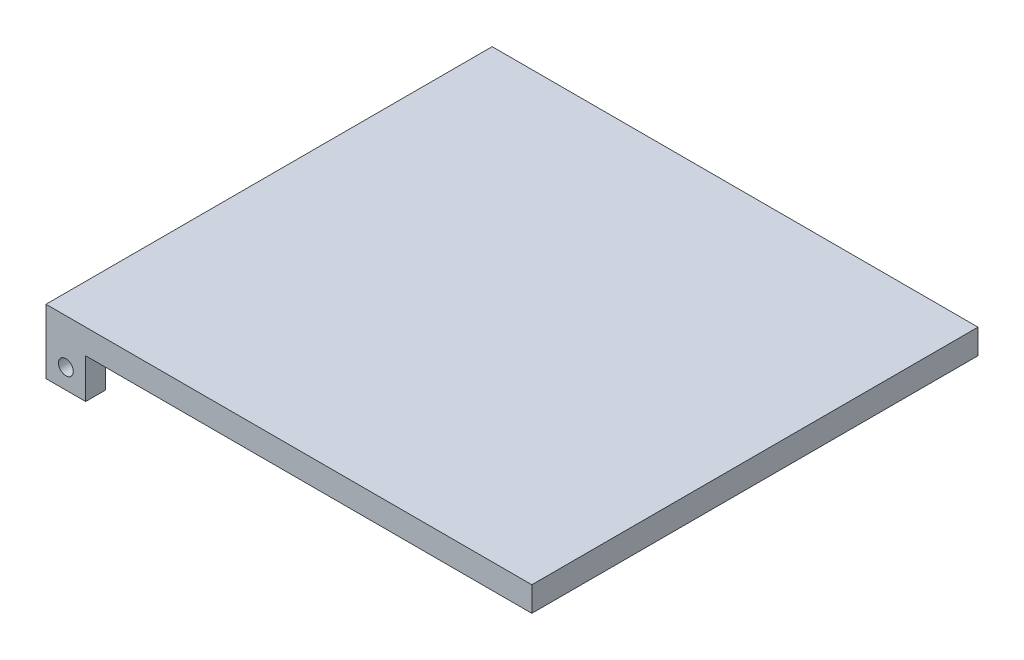
ISO-10303-21;
HEADER;
FILE_DESCRIPTION(('STEP AP214'),'2;1');
FILE_NAME('part.step','',(''),(''),'','','');
FILE_SCHEMA(('AUTOMOTIVE_DESIGN { 1 0 10303 214 1 1 1 1 }'));
ENDSEC;
DATA;
#1=APPLICATION_CONTEXT('core data for automotive mechanical design processes');
#2=APPLICATION_PROTOCOL_DEFINITION('international standard','automotive_design',2000,#1);
#3=PRODUCT_CONTEXT('',#1,'mechanical');
#4=PRODUCT('Part','Part','',(#3));
#5=PRODUCT_RELATED_PRODUCT_CATEGORY('part','',(#4));
#6=PRODUCT_DEFINITION_FORMATION('','',#4);
#7=PRODUCT_DEFINITION_CONTEXT('part definition',#1,'design');
#8=PRODUCT_DEFINITION('design','',#6,#7);
#9=PRODUCT_DEFINITION_SHAPE('','',#8);
#10=(LENGTH_UNIT() NAMED_UNIT(*) SI_UNIT(.MILLI.,.METRE.));
#11=(NAMED_UNIT(*) PLANE_ANGLE_UNIT() SI_UNIT($,.RADIAN.));
#12=(NAMED_UNIT(*) SI_UNIT($,.STERADIAN.) SOLID_ANGLE_UNIT());
#13=UNCERTAINTY_MEASURE_WITH_UNIT(LENGTH_MEASURE(1.E-05),#10,'distance_accuracy_value','');
#14=(GEOMETRIC_REPRESENTATION_CONTEXT(3) GLOBAL_UNCERTAINTY_ASSIGNED_CONTEXT((#13)) GLOBAL_UNIT_ASSIGNED_CONTEXT((#10,
#11,#12)) REPRESENTATION_CONTEXT('',''));
#15=CARTESIAN_POINT('',(0.,0.,0.));
#16=DIRECTION('',(0.,0.,1.));
#17=DIRECTION('',(1.,0.,0.));
#18=AXIS2_PLACEMENT_3D('',#15,#16,#17);
#19=CARTESIAN_POINT('',(0.,0.,0.));
#20=DIRECTION('',(0.,-1.,0.));
#21=DIRECTION('',(0.,0.,-1.));
#22=AXIS2_PLACEMENT_3D('',#19,#20,#21);
#23=PLANE('',#22);
#24=DIRECTION('',(0.,0.,1.));
#25=VECTOR('',#24,1.);
#26=CARTESIAN_POINT('',(-16.4,0.,16.4));
#27=LINE('',#26,#25);
#28=CARTESIAN_POINT('',(-16.4,0.,16.4));
#29=VERTEX_POINT('',#28);
#30=CARTESIAN_POINT('',(-16.4,0.,18.));
#31=VERTEX_POINT('',#30);
#32=EDGE_CURVE('E132',#29,#31,#27,.T.);
#33=ORIENTED_EDGE('',*,*,#32,.F.);
#34=DIRECTION('',(1.,0.,0.));
#35=VECTOR('',#34,1.);
#36=CARTESIAN_POINT('',(-19.6,0.,16.4));
#37=LINE('',#36,#35);
#38=CARTESIAN_POINT('',(-19.6,0.,16.4));
#39=VERTEX_POINT('',#38);
#40=EDGE_CURVE('E241',#39,#29,#37,.T.);
#41=ORIENTED_EDGE('',*,*,#40,.F.);
#42=DIRECTION('',(0.,0.,1.));
#43=VECTOR('',#42,1.);
#44=CARTESIAN_POINT('',(-19.6,0.,18.));
#45=LINE('',#44,#43);
#46=CARTESIAN_POINT('',(-19.6,0.,-16.4));
#47=VERTEX_POINT('',#46);
#48=EDGE_CURVE('E137',#47,#39,#45,.T.);
#49=ORIENTED_EDGE('',*,*,#48,.F.);
#50=DIRECTION('',(-1.,0.,0.));
#51=VECTOR('',#50,1.);
#52=CARTESIAN_POINT('',(-19.6,0.,-16.4));
#53=LINE('',#52,#51);
#54=CARTESIAN_POINT('',(-16.4,0.,-16.4));
#55=VERTEX_POINT('',#54);
#56=EDGE_CURVE('E139',#55,#47,#53,.T.);
#57=ORIENTED_EDGE('',*,*,#56,.F.);
#58=DIRECTION('',(0.,0.,1.));
#59=VECTOR('',#58,1.);
#60=CARTESIAN_POINT('',(-16.4,0.,-18.));
#61=LINE('',#60,#59);
#62=CARTESIAN_POINT('',(-16.4,0.,-18.));
#63=VERTEX_POINT('',#62);
#64=EDGE_CURVE('E59',#63,#55,#61,.T.);
#65=ORIENTED_EDGE('',*,*,#64,.F.);
#66=DIRECTION('',(-1.,0.,0.));
#67=VECTOR('',#66,1.);
#68=CARTESIAN_POINT('',(-19.6,0.,-18.));
#69=LINE('',#68,#67);
#70=CARTESIAN_POINT('',(19.6,0.,-18.));
#71=VERTEX_POINT('',#70);
#72=EDGE_CURVE('E177',#71,#63,#69,.T.);
#73=ORIENTED_EDGE('',*,*,#72,.F.);
#74=DIRECTION('',(0.,0.,-1.));
#75=VECTOR('',#74,1.);
#76=CARTESIAN_POINT('',(19.6,0.,18.));
#77=LINE('',#76,#75);
#78=CARTESIAN_POINT('',(19.6,0.,18.));
#79=VERTEX_POINT('',#78);
#80=EDGE_CURVE('E163',#79,#71,#77,.T.);
#81=ORIENTED_EDGE('',*,*,#80,.F.);
#82=DIRECTION('',(1.,0.,0.));
#83=VECTOR('',#82,1.);
#84=CARTESIAN_POINT('',(-19.6,0.,18.));
#85=LINE('',#84,#83);
#86=EDGE_CURVE('E168',#31,#79,#85,.T.);
#87=ORIENTED_EDGE('',*,*,#86,.F.);
#88=EDGE_LOOP('',(#33,#41,#49,#57,#65,#73,#81,#87));
#89=FACE_BOUND('',#88,.T.);
#90=ADVANCED_FACE('F35',(#89),#23,.T.);
#91=CARTESIAN_POINT('',(19.6,2.,18.));
#92=DIRECTION('',(-1.,0.,0.));
#93=DIRECTION('',(0.,0.,1.));
#94=AXIS2_PLACEMENT_3D('',#91,#92,#93);
#95=PLANE('',#94);
#96=ORIENTED_EDGE('',*,*,#80,.T.);
#97=DIRECTION('',(0.,-1.,0.));
#98=VECTOR('',#97,1.);
#99=CARTESIAN_POINT('',(19.6,2.,-18.));
#100=LINE('',#99,#98);
#101=CARTESIAN_POINT('',(19.6,2.,-18.));
#102=VERTEX_POINT('',#101);
#103=EDGE_CURVE('E11',#102,#71,#100,.T.);
#104=ORIENTED_EDGE('',*,*,#103,.F.);
#105=DIRECTION('',(0.,0.,-1.));
#106=VECTOR('',#105,1.);
#107=CARTESIAN_POINT('',(19.6,2.,18.));
#108=LINE('',#107,#106);
#109=CARTESIAN_POINT('',(19.6,2.,18.));
#110=VERTEX_POINT('',#109);
#111=EDGE_CURVE('E164',#110,#102,#108,.T.);
#112=ORIENTED_EDGE('',*,*,#111,.F.);
#113=DIRECTION('',(0.,-1.,0.));
#114=VECTOR('',#113,1.);
#115=CARTESIAN_POINT('',(19.6,2.,18.));
#116=LINE('',#115,#114);
#117=EDGE_CURVE('E174',#110,#79,#116,.T.);
#118=ORIENTED_EDGE('',*,*,#117,.T.);
#119=EDGE_LOOP('',(#96,#104,#112,#118));
#120=FACE_BOUND('',#119,.T.);
#121=ADVANCED_FACE('F37',(#120),#95,.F.);
#122=CARTESIAN_POINT('',(-19.6,2.,-18.));
#123=DIRECTION('',(0.,0.,1.));
#124=DIRECTION('',(1.,0.,0.));
#125=AXIS2_PLACEMENT_3D('',#122,#123,#124);
#126=PLANE('',#125);
#127=CARTESIAN_POINT('',(-18.,-1.6,-18.));
#128=DIRECTION('',(0.,0.,-1.));
#129=DIRECTION('',(-1.,0.,0.));
#130=AXIS2_PLACEMENT_3D('',#127,#128,#129);
#131=CIRCLE('',#130,0.6);
#132=CARTESIAN_POINT('',(-18.6,-1.6,-18.));
#133=VERTEX_POINT('',#132);
#134=EDGE_CURVE('E232',#133,#133,#131,.T.);
#135=ORIENTED_EDGE('',*,*,#134,.F.);
#136=EDGE_LOOP('',(#135));
#137=FACE_BOUND('',#136,.T.);
#138=ORIENTED_EDGE('',*,*,#72,.T.);
#139=DIRECTION('',(0.,1.,0.));
#140=VECTOR('',#139,1.);
#141=CARTESIAN_POINT('',(-16.4,-3.2,-18.));
#142=LINE('',#141,#140);
#143=CARTESIAN_POINT('',(-16.4,-3.2,-18.));
#144=VERTEX_POINT('',#143);
#145=EDGE_CURVE('E160',#144,#63,#142,.T.);
#146=ORIENTED_EDGE('',*,*,#145,.F.);
#147=DIRECTION('',(1.,0.,0.));
#148=VECTOR('',#147,1.);
#149=CARTESIAN_POINT('',(-19.6,-3.2,-18.));
#150=LINE('',#149,#148);
#151=CARTESIAN_POINT('',(-19.6,-3.2,-18.));
#152=VERTEX_POINT('',#151);
#153=EDGE_CURVE('E147',#152,#144,#150,.T.);
#154=ORIENTED_EDGE('',*,*,#153,.F.);
#155=DIRECTION('',(0.,-1.,0.));
#156=VECTOR('',#155,1.);
#157=CARTESIAN_POINT('',(-19.6,2.,-18.));
#158=LINE('',#157,#156);
#159=CARTESIAN_POINT('',(-19.6,2.,-18.));
#160=VERTEX_POINT('',#159);
#161=EDGE_CURVE('E44',#160,#152,#158,.T.);
#162=ORIENTED_EDGE('',*,*,#161,.F.);
#163=DIRECTION('',(-1.,0.,0.));
#164=VECTOR('',#163,1.);
#165=CARTESIAN_POINT('',(-19.6,2.,-18.));
#166=LINE('',#165,#164);
#167=EDGE_CURVE('E167',#102,#160,#166,.T.);
#168=ORIENTED_EDGE('',*,*,#167,.F.);
#169=ORIENTED_EDGE('',*,*,#103,.T.);
#170=EDGE_LOOP('',(#138,#146,#154,#162,#168,#169));
#171=FACE_BOUND('',#170,.T.);
#172=ADVANCED_FACE('F191',(#137,#171),#126,.F.);
#173=CARTESIAN_POINT('',(-19.6,2.,18.));
#174=DIRECTION('',(1.,0.,0.));
#175=DIRECTION('',(0.,0.,-1.));
#176=AXIS2_PLACEMENT_3D('',#173,#174,#175);
#177=PLANE('',#176);
#178=ORIENTED_EDGE('',*,*,#161,.T.);
#179=DIRECTION('',(0.,0.,-1.));
#180=VECTOR('',#179,1.);
#181=CARTESIAN_POINT('',(-19.6,-3.2,-18.));
#182=LINE('',#181,#180);
#183=CARTESIAN_POINT('',(-19.6,-3.2,-16.4));
#184=VERTEX_POINT('',#183);
#185=EDGE_CURVE('E144',#184,#152,#182,.T.);
#186=ORIENTED_EDGE('',*,*,#185,.F.);
#187=DIRECTION('',(0.,1.,0.));
#188=VECTOR('',#187,1.);
#189=CARTESIAN_POINT('',(-19.6,-3.2,-16.4));
#190=LINE('',#189,#188);
#191=EDGE_CURVE('E152',#184,#47,#190,.T.);
#192=ORIENTED_EDGE('',*,*,#191,.T.);
#193=ORIENTED_EDGE('',*,*,#48,.T.);
#194=DIRECTION('',(0.,1.,0.));
#195=VECTOR('',#194,1.);
#196=CARTESIAN_POINT('',(-19.6,-3.2,16.4));
#197=LINE('',#196,#195);
#198=CARTESIAN_POINT('',(-19.6,-3.2,16.4));
#199=VERTEX_POINT('',#198);
#200=EDGE_CURVE('E117',#199,#39,#197,.T.);
#201=ORIENTED_EDGE('',*,*,#200,.F.);
#202=DIRECTION('',(0.,0.,-1.));
#203=VECTOR('',#202,1.);
#204=CARTESIAN_POINT('',(-19.6,-3.2,16.4));
#205=LINE('',#204,#203);
#206=CARTESIAN_POINT('',(-19.6,-3.2,18.));
#207=VERTEX_POINT('',#206);
#208=EDGE_CURVE('E124',#207,#199,#205,.T.);
#209=ORIENTED_EDGE('',*,*,#208,.F.);
#210=DIRECTION('',(0.,-1.,0.));
#211=VECTOR('',#210,1.);
#212=CARTESIAN_POINT('',(-19.6,2.,18.));
#213=LINE('',#212,#211);
#214=CARTESIAN_POINT('',(-19.6,2.,18.));
#215=VERTEX_POINT('',#214);
#216=EDGE_CURVE('E183',#215,#207,#213,.T.);
#217=ORIENTED_EDGE('',*,*,#216,.F.);
#218=DIRECTION('',(0.,0.,1.));
#219=VECTOR('',#218,1.);
#220=CARTESIAN_POINT('',(-19.6,2.,18.));
#221=LINE('',#220,#219);
#222=EDGE_CURVE('E170',#160,#215,#221,.T.);
#223=ORIENTED_EDGE('',*,*,#222,.F.);
#224=EDGE_LOOP('',(#178,#186,#192,#193,#201,#209,#217,#223));
#225=FACE_BOUND('',#224,.T.);
#226=ADVANCED_FACE('F135',(#225),#177,.F.);
#227=CARTESIAN_POINT('',(-19.6,2.,18.));
#228=DIRECTION('',(0.,0.,-1.));
#229=DIRECTION('',(-1.,0.,0.));
#230=AXIS2_PLACEMENT_3D('',#227,#228,#229);
#231=PLANE('',#230);
#232=CARTESIAN_POINT('',(-18.,-1.6,18.));
#233=DIRECTION('',(0.,0.,-1.));
#234=DIRECTION('',(-1.,0.,0.));
#235=AXIS2_PLACEMENT_3D('',#232,#233,#234);
#236=CIRCLE('',#235,0.6);
#237=CARTESIAN_POINT('',(-18.6,-1.6,18.));
#238=VERTEX_POINT('',#237);
#239=EDGE_CURVE('E234',#238,#238,#236,.F.);
#240=ORIENTED_EDGE('',*,*,#239,.F.);
#241=EDGE_LOOP('',(#240));
#242=FACE_BOUND('',#241,.T.);
#243=ORIENTED_EDGE('',*,*,#216,.T.);
#244=DIRECTION('',(-1.,0.,0.));
#245=VECTOR('',#244,1.);
#246=CARTESIAN_POINT('',(-19.6,-3.2,18.));
#247=LINE('',#246,#245);
#248=CARTESIAN_POINT('',(-16.4,-3.2,18.));
#249=VERTEX_POINT('',#248);
#250=EDGE_CURVE('E129',#249,#207,#247,.T.);
#251=ORIENTED_EDGE('',*,*,#250,.F.);
#252=DIRECTION('',(0.,1.,0.));
#253=VECTOR('',#252,1.);
#254=CARTESIAN_POINT('',(-16.4,-3.2,18.));
#255=LINE('',#254,#253);
#256=EDGE_CURVE('E51',#249,#31,#255,.T.);
#257=ORIENTED_EDGE('',*,*,#256,.T.);
#258=ORIENTED_EDGE('',*,*,#86,.T.);
#259=ORIENTED_EDGE('',*,*,#117,.F.);
#260=DIRECTION('',(1.,0.,0.));
#261=VECTOR('',#260,1.);
#262=CARTESIAN_POINT('',(-19.6,2.,18.));
#263=LINE('',#262,#261);
#264=EDGE_CURVE('E172',#215,#110,#263,.T.);
#265=ORIENTED_EDGE('',*,*,#264,.F.);
#266=EDGE_LOOP('',(#243,#251,#257,#258,#259,#265));
#267=FACE_BOUND('',#266,.T.);
#268=ADVANCED_FACE('F212',(#242,#267),#231,.F.);
#269=CARTESIAN_POINT('',(0.,2.,0.));
#270=DIRECTION('',(0.,-1.,0.));
#271=DIRECTION('',(0.,0.,-1.));
#272=AXIS2_PLACEMENT_3D('',#269,#270,#271);
#273=PLANE('',#272);
#274=ORIENTED_EDGE('',*,*,#111,.T.);
#275=ORIENTED_EDGE('',*,*,#167,.T.);
#276=ORIENTED_EDGE('',*,*,#222,.T.);
#277=ORIENTED_EDGE('',*,*,#264,.T.);
#278=EDGE_LOOP('',(#274,#275,#276,#277));
#279=FACE_BOUND('',#278,.T.);
#280=ADVANCED_FACE('F204',(#279),#273,.F.);
#281=CARTESIAN_POINT('',(-16.4,-3.2,-18.));
#282=DIRECTION('',(-1.,0.,0.));
#283=DIRECTION('',(0.,0.,1.));
#284=AXIS2_PLACEMENT_3D('',#281,#282,#283);
#285=PLANE('',#284);
#286=ORIENTED_EDGE('',*,*,#64,.T.);
#287=DIRECTION('',(0.,1.,0.));
#288=VECTOR('',#287,1.);
#289=CARTESIAN_POINT('',(-16.4,-3.2,-16.4));
#290=LINE('',#289,#288);
#291=CARTESIAN_POINT('',(-16.4,-3.2,-16.4));
#292=VERTEX_POINT('',#291);
#293=EDGE_CURVE('E157',#292,#55,#290,.T.);
#294=ORIENTED_EDGE('',*,*,#293,.F.);
#295=DIRECTION('',(0.,0.,1.));
#296=VECTOR('',#295,1.);
#297=CARTESIAN_POINT('',(-16.4,-3.2,-18.));
#298=LINE('',#297,#296);
#299=EDGE_CURVE('E149',#144,#292,#298,.T.);
#300=ORIENTED_EDGE('',*,*,#299,.F.);
#301=ORIENTED_EDGE('',*,*,#145,.T.);
#302=EDGE_LOOP('',(#286,#294,#300,#301));
#303=FACE_BOUND('',#302,.T.);
#304=ADVANCED_FACE('F202',(#303),#285,.F.);
#305=CARTESIAN_POINT('',(-19.6,-3.2,-16.4));
#306=DIRECTION('',(0.,0.,-1.));
#307=DIRECTION('',(-1.,0.,0.));
#308=AXIS2_PLACEMENT_3D('',#305,#306,#307);
#309=PLANE('',#308);
#310=CARTESIAN_POINT('',(-18.,-1.6,-16.4));
#311=DIRECTION('',(0.,0.,-1.));
#312=DIRECTION('',(-1.,0.,0.));
#313=AXIS2_PLACEMENT_3D('',#310,#311,#312);
#314=CIRCLE('',#313,0.6);
#315=CARTESIAN_POINT('',(-18.6,-1.6,-16.4));
#316=VERTEX_POINT('',#315);
#317=EDGE_CURVE('E239',#316,#316,#314,.T.);
#318=ORIENTED_EDGE('',*,*,#317,.T.);
#319=EDGE_LOOP('',(#318));
#320=FACE_BOUND('',#319,.T.);
#321=ORIENTED_EDGE('',*,*,#56,.T.);
#322=ORIENTED_EDGE('',*,*,#191,.F.);
#323=DIRECTION('',(-1.,0.,0.));
#324=VECTOR('',#323,1.);
#325=CARTESIAN_POINT('',(-19.6,-3.2,-16.4));
#326=LINE('',#325,#324);
#327=EDGE_CURVE('E151',#292,#184,#326,.T.);
#328=ORIENTED_EDGE('',*,*,#327,.F.);
#329=ORIENTED_EDGE('',*,*,#293,.T.);
#330=EDGE_LOOP('',(#321,#322,#328,#329));
#331=FACE_BOUND('',#330,.T.);
#332=ADVANCED_FACE('F199',(#320,#331),#309,.F.);
#333=CARTESIAN_POINT('',(0.,-3.2,0.));
#334=DIRECTION('',(0.,1.,0.));
#335=DIRECTION('',(0.,0.,1.));
#336=AXIS2_PLACEMENT_3D('',#333,#334,#335);
#337=PLANE('',#336);
#338=ORIENTED_EDGE('',*,*,#185,.T.);
#339=ORIENTED_EDGE('',*,*,#153,.T.);
#340=ORIENTED_EDGE('',*,*,#299,.T.);
#341=ORIENTED_EDGE('',*,*,#327,.T.);
#342=EDGE_LOOP('',(#338,#339,#340,#341));
#343=FACE_BOUND('',#342,.T.);
#344=ADVANCED_FACE('F194',(#343),#337,.F.);
#345=CARTESIAN_POINT('',(-19.6,-3.2,16.4));
#346=DIRECTION('',(0.,0.,1.));
#347=DIRECTION('',(1.,0.,0.));
#348=AXIS2_PLACEMENT_3D('',#345,#346,#347);
#349=PLANE('',#348);
#350=CARTESIAN_POINT('',(-18.,-1.6,16.4));
#351=DIRECTION('',(0.,0.,1.));
#352=DIRECTION('',(1.,0.,0.));
#353=AXIS2_PLACEMENT_3D('',#350,#351,#352);
#354=CIRCLE('',#353,0.6);
#355=CARTESIAN_POINT('',(-17.4,-1.6,16.4));
#356=VERTEX_POINT('',#355);
#357=EDGE_CURVE('E39',#356,#356,#354,.T.);
#358=ORIENTED_EDGE('',*,*,#357,.T.);
#359=EDGE_LOOP('',(#358));
#360=FACE_BOUND('',#359,.T.);
#361=ORIENTED_EDGE('',*,*,#40,.T.);
#362=DIRECTION('',(0.,1.,0.));
#363=VECTOR('',#362,1.);
#364=CARTESIAN_POINT('',(-16.4,-3.2,16.4));
#365=LINE('',#364,#363);
#366=CARTESIAN_POINT('',(-16.4,-3.2,16.4));
#367=VERTEX_POINT('',#366);
#368=EDGE_CURVE('E120',#367,#29,#365,.T.);
#369=ORIENTED_EDGE('',*,*,#368,.F.);
#370=DIRECTION('',(1.,0.,0.));
#371=VECTOR('',#370,1.);
#372=CARTESIAN_POINT('',(-19.6,-3.2,16.4));
#373=LINE('',#372,#371);
#374=EDGE_CURVE('E113',#199,#367,#373,.T.);
#375=ORIENTED_EDGE('',*,*,#374,.F.);
#376=ORIENTED_EDGE('',*,*,#200,.T.);
#377=EDGE_LOOP('',(#361,#369,#375,#376));
#378=FACE_BOUND('',#377,.T.);
#379=ADVANCED_FACE('F115',(#360,#378),#349,.F.);
#380=CARTESIAN_POINT('',(-16.4,-3.2,16.4));
#381=DIRECTION('',(-1.,0.,0.));
#382=DIRECTION('',(0.,0.,1.));
#383=AXIS2_PLACEMENT_3D('',#380,#381,#382);
#384=PLANE('',#383);
#385=ORIENTED_EDGE('',*,*,#32,.T.);
#386=ORIENTED_EDGE('',*,*,#256,.F.);
#387=DIRECTION('',(0.,0.,1.));
#388=VECTOR('',#387,1.);
#389=CARTESIAN_POINT('',(-16.4,-3.2,16.4));
#390=LINE('',#389,#388);
#391=EDGE_CURVE('E123',#367,#249,#390,.T.);
#392=ORIENTED_EDGE('',*,*,#391,.F.);
#393=ORIENTED_EDGE('',*,*,#368,.T.);
#394=EDGE_LOOP('',(#385,#386,#392,#393));
#395=FACE_BOUND('',#394,.T.);
#396=ADVANCED_FACE('F248',(#395),#384,.F.);
#397=CARTESIAN_POINT('',(0.,-3.2,0.));
#398=DIRECTION('',(0.,1.,0.));
#399=DIRECTION('',(0.,0.,1.));
#400=AXIS2_PLACEMENT_3D('',#397,#398,#399);
#401=PLANE('',#400);
#402=ORIENTED_EDGE('',*,*,#208,.T.);
#403=ORIENTED_EDGE('',*,*,#374,.T.);
#404=ORIENTED_EDGE('',*,*,#391,.T.);
#405=ORIENTED_EDGE('',*,*,#250,.T.);
#406=EDGE_LOOP('',(#402,#403,#404,#405));
#407=FACE_BOUND('',#406,.T.);
#408=ADVANCED_FACE('F128',(#407),#401,.F.);
#409=CARTESIAN_POINT('',(-18.,-1.6,19.6970562748477));
#410=DIRECTION('',(0.,0.,-1.));
#411=DIRECTION('',(-1.,0.,0.));
#412=AXIS2_PLACEMENT_3D('',#409,#410,#411);
#413=CYLINDRICAL_SURFACE('',#412,0.6);
#414=ORIENTED_EDGE('',*,*,#239,.T.);
#415=EDGE_LOOP('',(#414));
#416=FACE_BOUND('',#415,.T.);
#417=ORIENTED_EDGE('',*,*,#357,.F.);
#418=EDGE_LOOP('',(#417));
#419=FACE_BOUND('',#418,.T.);
#420=ADVANCED_FACE('F260',(#416,#419),#413,.F.);
#421=ORIENTED_EDGE('',*,*,#134,.T.);
#422=EDGE_LOOP('',(#421));
#423=FACE_BOUND('',#422,.T.);
#424=ORIENTED_EDGE('',*,*,#317,.F.);
#425=EDGE_LOOP('',(#424));
#426=FACE_BOUND('',#425,.T.);
#427=ADVANCED_FACE('F288',(#423,#426),#413,.F.);
#428=CLOSED_SHELL('',(#90,#121,#172,#226,#268,#280,#304,#332,#344,#379,#396,#408,#420,#427));
#429=MANIFOLD_SOLID_BREP('B2',#428);
#430=ADVANCED_BREP_SHAPE_REPRESENTATION('',(#18,#429),#14);
#431=SHAPE_DEFINITION_REPRESENTATION(#9,#430);
ENDSEC;
END-ISO-10303-21;
